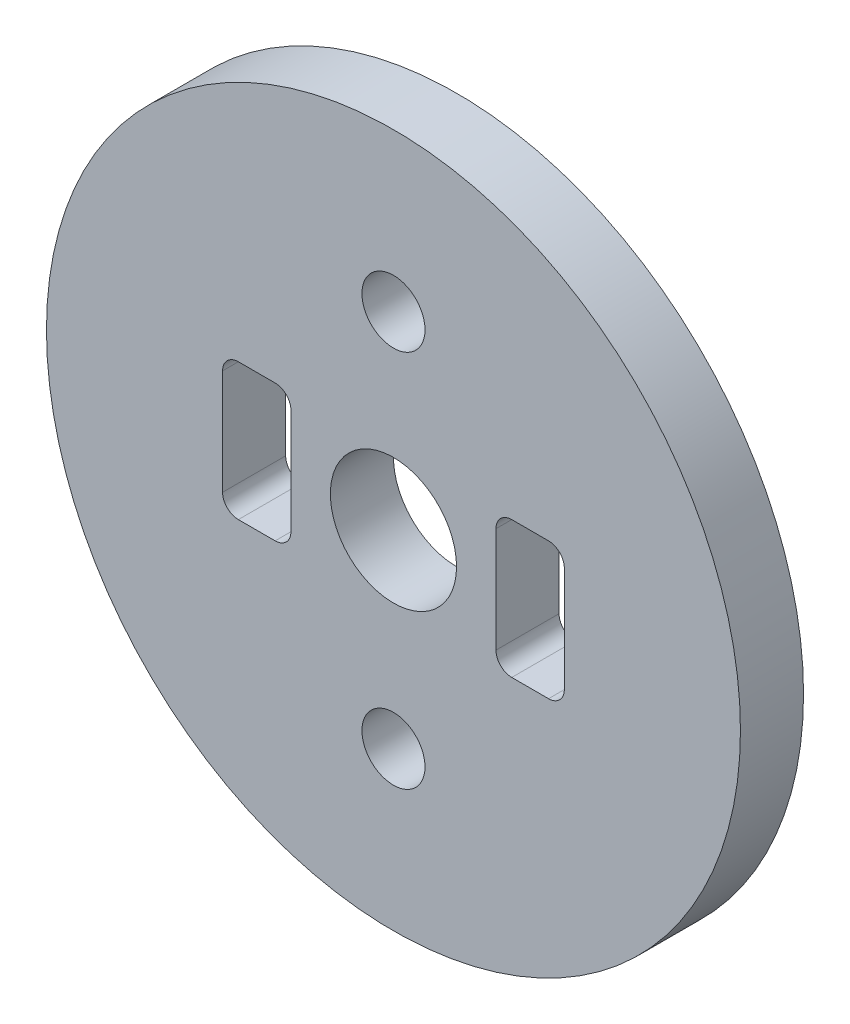
ISO-10303-21;
HEADER;
FILE_DESCRIPTION(('STEP AP214'),'2;1');
FILE_NAME('part.step','',(''),(''),'','','');
FILE_SCHEMA(('AUTOMOTIVE_DESIGN { 1 0 10303 214 1 1 1 1 }'));
ENDSEC;
DATA;
#1=APPLICATION_CONTEXT('core data for automotive mechanical design processes');
#2=APPLICATION_PROTOCOL_DEFINITION('international standard','automotive_design',2000,#1);
#3=PRODUCT_CONTEXT('',#1,'mechanical');
#4=PRODUCT('Part','Part','',(#3));
#5=PRODUCT_RELATED_PRODUCT_CATEGORY('part','',(#4));
#6=PRODUCT_DEFINITION_FORMATION('','',#4);
#7=PRODUCT_DEFINITION_CONTEXT('part definition',#1,'design');
#8=PRODUCT_DEFINITION('design','',#6,#7);
#9=PRODUCT_DEFINITION_SHAPE('','',#8);
#10=(LENGTH_UNIT() NAMED_UNIT(*) SI_UNIT(.MILLI.,.METRE.));
#11=(NAMED_UNIT(*) PLANE_ANGLE_UNIT() SI_UNIT($,.RADIAN.));
#12=(NAMED_UNIT(*) SI_UNIT($,.STERADIAN.) SOLID_ANGLE_UNIT());
#13=UNCERTAINTY_MEASURE_WITH_UNIT(LENGTH_MEASURE(1.E-05),#10,'distance_accuracy_value','');
#14=(GEOMETRIC_REPRESENTATION_CONTEXT(3) GLOBAL_UNCERTAINTY_ASSIGNED_CONTEXT((#13)) GLOBAL_UNIT_ASSIGNED_CONTEXT((#10,
#11,#12)) REPRESENTATION_CONTEXT('',''));
#15=CARTESIAN_POINT('',(0.,0.,0.));
#16=DIRECTION('',(0.,0.,1.));
#17=DIRECTION('',(1.,0.,0.));
#18=AXIS2_PLACEMENT_3D('',#15,#16,#17);
#19=CARTESIAN_POINT('',(215.7478079135,241.9520199932,3.));
#20=DIRECTION('',(0.,0.,1.));
#21=DIRECTION('',(1.,0.,0.));
#22=AXIS2_PLACEMENT_3D('',#19,#20,#21);
#23=PLANE('',#22);
#24=DIRECTION('',(0.,-1.,0.));
#25=VECTOR('',#24,1.);
#26=CARTESIAN_POINT('',(220.6228079135,244.4520199932,3.));
#27=LINE('',#26,#25);
#28=CARTESIAN_POINT('',(220.6228079135,244.4520199932,3.));
#29=VERTEX_POINT('',#28);
#30=CARTESIAN_POINT('',(220.6228079135,239.4520199932,3.));
#31=VERTEX_POINT('',#30);
#32=EDGE_CURVE('E213',#29,#31,#27,.T.);
#33=ORIENTED_EDGE('',*,*,#32,.F.);
#34=CARTESIAN_POINT('',(221.3728079135,244.4520199932,3.));
#35=DIRECTION('',(0.,0.,1.));
#36=DIRECTION('',(1.,0.,0.));
#37=AXIS2_PLACEMENT_3D('',#34,#35,#36);
#38=CIRCLE('',#37,0.750000000000001);
#39=CARTESIAN_POINT('',(221.3728079135,245.2020199932,3.));
#40=VERTEX_POINT('',#39);
#41=EDGE_CURVE('E211',#40,#29,#38,.T.);
#42=ORIENTED_EDGE('',*,*,#41,.F.);
#43=DIRECTION('',(-1.,0.,0.));
#44=VECTOR('',#43,1.);
#45=CARTESIAN_POINT('',(223.1228079135,245.2020199932,3.));
#46=LINE('',#45,#44);
#47=CARTESIAN_POINT('',(223.1228079135,245.2020199932,3.));
#48=VERTEX_POINT('',#47);
#49=EDGE_CURVE('E227',#48,#40,#46,.T.);
#50=ORIENTED_EDGE('',*,*,#49,.F.);
#51=CARTESIAN_POINT('',(223.1228079135,244.4520199932,3.));
#52=DIRECTION('',(0.,0.,1.));
#53=DIRECTION('',(1.,0.,0.));
#54=AXIS2_PLACEMENT_3D('',#51,#52,#53);
#55=CIRCLE('',#54,0.750000000000001);
#56=CARTESIAN_POINT('',(223.8728079135,244.4520199932,3.));
#57=VERTEX_POINT('',#56);
#58=EDGE_CURVE('E224',#57,#48,#55,.T.);
#59=ORIENTED_EDGE('',*,*,#58,.F.);
#60=DIRECTION('',(0.,1.,0.));
#61=VECTOR('',#60,1.);
#62=CARTESIAN_POINT('',(223.8728079135,239.4520199932,3.));
#63=LINE('',#62,#61);
#64=CARTESIAN_POINT('',(223.8728079135,239.4520199932,3.));
#65=VERTEX_POINT('',#64);
#66=EDGE_CURVE('E222',#65,#57,#63,.T.);
#67=ORIENTED_EDGE('',*,*,#66,.F.);
#68=CARTESIAN_POINT('',(223.1228079135,239.4520199932,3.));
#69=DIRECTION('',(0.,0.,1.));
#70=DIRECTION('',(1.,0.,0.));
#71=AXIS2_PLACEMENT_3D('',#68,#69,#70);
#72=CIRCLE('',#71,0.750000000000001);
#73=CARTESIAN_POINT('',(223.1228079135,238.7020199932,3.));
#74=VERTEX_POINT('',#73);
#75=EDGE_CURVE('E220',#74,#65,#72,.T.);
#76=ORIENTED_EDGE('',*,*,#75,.F.);
#77=DIRECTION('',(1.,0.,0.));
#78=VECTOR('',#77,1.);
#79=CARTESIAN_POINT('',(221.3728079135,238.7020199932,3.));
#80=LINE('',#79,#78);
#81=CARTESIAN_POINT('',(221.3728079135,238.7020199932,3.));
#82=VERTEX_POINT('',#81);
#83=EDGE_CURVE('E218',#82,#74,#80,.T.);
#84=ORIENTED_EDGE('',*,*,#83,.F.);
#85=CARTESIAN_POINT('',(221.3728079135,239.4520199932,3.));
#86=DIRECTION('',(0.,0.,1.));
#87=DIRECTION('',(1.,0.,0.));
#88=AXIS2_PLACEMENT_3D('',#85,#86,#87);
#89=CIRCLE('',#88,0.750000000000001);
#90=EDGE_CURVE('E216',#31,#82,#89,.T.);
#91=ORIENTED_EDGE('',*,*,#90,.F.);
#92=EDGE_LOOP('',(#33,#42,#50,#59,#67,#76,#84,#91));
#93=FACE_BOUND('',#92,.T.);
#94=CARTESIAN_POINT('',(215.7478079135,232.9520199932,3.));
#95=DIRECTION('',(0.,0.,1.));
#96=DIRECTION('',(1.,0.,0.));
#97=AXIS2_PLACEMENT_3D('',#94,#95,#96);
#98=CIRCLE('',#97,1.5);
#99=CARTESIAN_POINT('',(217.2478079135,232.9520199932,3.));
#100=VERTEX_POINT('',#99);
#101=EDGE_CURVE('E276',#100,#100,#98,.T.);
#102=ORIENTED_EDGE('',*,*,#101,.F.);
#103=EDGE_LOOP('',(#102));
#104=FACE_BOUND('',#103,.T.);
#105=CARTESIAN_POINT('',(215.7478079135,241.9520199932,3.));
#106=DIRECTION('',(0.,0.,1.));
#107=DIRECTION('',(1.,0.,0.));
#108=AXIS2_PLACEMENT_3D('',#105,#106,#107);
#109=CIRCLE('',#108,16.5);
#110=CARTESIAN_POINT('',(232.2478079135,241.9520199932,3.));
#111=VERTEX_POINT('',#110);
#112=EDGE_CURVE('E11',#111,#111,#109,.T.);
#113=ORIENTED_EDGE('',*,*,#112,.T.);
#114=EDGE_LOOP('',(#113));
#115=FACE_BOUND('',#114,.T.);
#116=CARTESIAN_POINT('',(215.7478079135,241.9520199932,3.));
#117=DIRECTION('',(0.,0.,1.));
#118=DIRECTION('',(1.,0.,0.));
#119=AXIS2_PLACEMENT_3D('',#116,#117,#118);
#120=CIRCLE('',#119,3.);
#121=CARTESIAN_POINT('',(218.7478079135,241.9520199932,3.));
#122=VERTEX_POINT('',#121);
#123=EDGE_CURVE('E282',#122,#122,#120,.T.);
#124=ORIENTED_EDGE('',*,*,#123,.F.);
#125=EDGE_LOOP('',(#124));
#126=FACE_BOUND('',#125,.T.);
#127=CARTESIAN_POINT('',(215.7478079135,250.9520199932,3.));
#128=DIRECTION('',(0.,0.,1.));
#129=DIRECTION('',(1.,0.,0.));
#130=AXIS2_PLACEMENT_3D('',#127,#128,#129);
#131=CIRCLE('',#130,1.5);
#132=CARTESIAN_POINT('',(217.2478079135,250.9520199932,3.));
#133=VERTEX_POINT('',#132);
#134=EDGE_CURVE('E270',#133,#133,#131,.T.);
#135=ORIENTED_EDGE('',*,*,#134,.F.);
#136=EDGE_LOOP('',(#135));
#137=FACE_BOUND('',#136,.T.);
#138=DIRECTION('',(-1.,0.,0.));
#139=VECTOR('',#138,1.);
#140=CARTESIAN_POINT('',(208.3728079135,245.2020199932,3.));
#141=LINE('',#140,#139);
#142=CARTESIAN_POINT('',(210.1228079135,245.2020199932,3.));
#143=VERTEX_POINT('',#142);
#144=CARTESIAN_POINT('',(208.3728079135,245.2020199932,3.));
#145=VERTEX_POINT('',#144);
#146=EDGE_CURVE('E154',#143,#145,#141,.T.);
#147=ORIENTED_EDGE('',*,*,#146,.F.);
#148=CARTESIAN_POINT('',(210.1228079135,244.4520199932,3.));
#149=DIRECTION('',(0.,0.,1.));
#150=DIRECTION('',(1.,0.,0.));
#151=AXIS2_PLACEMENT_3D('',#148,#149,#150);
#152=CIRCLE('',#151,0.750000000000001);
#153=CARTESIAN_POINT('',(210.8728079135,244.4520199932,3.));
#154=VERTEX_POINT('',#153);
#155=EDGE_CURVE('E146',#154,#143,#152,.T.);
#156=ORIENTED_EDGE('',*,*,#155,.F.);
#157=DIRECTION('',(0.,1.,0.));
#158=VECTOR('',#157,1.);
#159=CARTESIAN_POINT('',(210.8728079135,244.4520199932,3.));
#160=LINE('',#159,#158);
#161=CARTESIAN_POINT('',(210.8728079135,239.4520199932,3.));
#162=VERTEX_POINT('',#161);
#163=EDGE_CURVE('E179',#162,#154,#160,.T.);
#164=ORIENTED_EDGE('',*,*,#163,.F.);
#165=CARTESIAN_POINT('',(210.1228079135,239.4520199932,3.));
#166=DIRECTION('',(0.,0.,1.));
#167=DIRECTION('',(1.,0.,0.));
#168=AXIS2_PLACEMENT_3D('',#165,#166,#167);
#169=CIRCLE('',#168,0.750000000000001);
#170=CARTESIAN_POINT('',(210.1228079135,238.7020199932,3.));
#171=VERTEX_POINT('',#170);
#172=EDGE_CURVE('E177',#171,#162,#169,.T.);
#173=ORIENTED_EDGE('',*,*,#172,.F.);
#174=DIRECTION('',(1.,0.,0.));
#175=VECTOR('',#174,1.);
#176=CARTESIAN_POINT('',(210.1228079135,238.7020199932,3.));
#177=LINE('',#176,#175);
#178=CARTESIAN_POINT('',(208.3728079135,238.7020199932,3.));
#179=VERTEX_POINT('',#178);
#180=EDGE_CURVE('E175',#179,#171,#177,.T.);
#181=ORIENTED_EDGE('',*,*,#180,.F.);
#182=CARTESIAN_POINT('',(208.3728079135,239.4520199932,3.));
#183=DIRECTION('',(0.,0.,1.));
#184=DIRECTION('',(1.,0.,0.));
#185=AXIS2_PLACEMENT_3D('',#182,#183,#184);
#186=CIRCLE('',#185,0.750000000000237);
#187=CARTESIAN_POINT('',(207.6228079135,239.4520199932,3.));
#188=VERTEX_POINT('',#187);
#189=EDGE_CURVE('E173',#188,#179,#186,.T.);
#190=ORIENTED_EDGE('',*,*,#189,.F.);
#191=DIRECTION('',(0.,-1.,0.));
#192=VECTOR('',#191,1.);
#193=CARTESIAN_POINT('',(207.6228079135,239.4520199932,3.));
#194=LINE('',#193,#192);
#195=CARTESIAN_POINT('',(207.6228079135,244.4520199932,3.));
#196=VERTEX_POINT('',#195);
#197=EDGE_CURVE('E169',#196,#188,#194,.T.);
#198=ORIENTED_EDGE('',*,*,#197,.F.);
#199=CARTESIAN_POINT('',(208.3728079135,244.4520199932,3.));
#200=DIRECTION('',(0.,0.,1.));
#201=DIRECTION('',(1.,0.,0.));
#202=AXIS2_PLACEMENT_3D('',#199,#200,#201);
#203=CIRCLE('',#202,0.750000000000001);
#204=EDGE_CURVE('E167',#145,#196,#203,.T.);
#205=ORIENTED_EDGE('',*,*,#204,.F.);
#206=EDGE_LOOP('',(#147,#156,#164,#173,#181,#190,#198,#205));
#207=FACE_BOUND('',#206,.T.);
#208=ADVANCED_FACE('F33',(#93,#104,#115,#126,#137,#207),#23,.T.);
#209=CARTESIAN_POINT('',(215.7478079135,241.9520199932,0.));
#210=DIRECTION('',(0.,0.,1.));
#211=DIRECTION('',(1.,0.,0.));
#212=AXIS2_PLACEMENT_3D('',#209,#210,#211);
#213=PLANE('',#212);
#214=CARTESIAN_POINT('',(221.3728079135,244.4520199932,0.));
#215=DIRECTION('',(0.,0.,1.));
#216=DIRECTION('',(1.,0.,0.));
#217=AXIS2_PLACEMENT_3D('',#214,#215,#216);
#218=CIRCLE('',#217,0.750000000000001);
#219=CARTESIAN_POINT('',(221.3728079135,245.2020199932,0.));
#220=VERTEX_POINT('',#219);
#221=CARTESIAN_POINT('',(220.6228079135,244.4520199932,0.));
#222=VERTEX_POINT('',#221);
#223=EDGE_CURVE('E162',#220,#222,#218,.T.);
#224=ORIENTED_EDGE('',*,*,#223,.T.);
#225=DIRECTION('',(0.,-1.,0.));
#226=VECTOR('',#225,1.);
#227=CARTESIAN_POINT('',(220.6228079135,244.4520199932,0.));
#228=LINE('',#227,#226);
#229=CARTESIAN_POINT('',(220.6228079135,239.4520199932,0.));
#230=VERTEX_POINT('',#229);
#231=EDGE_CURVE('E232',#222,#230,#228,.T.);
#232=ORIENTED_EDGE('',*,*,#231,.T.);
#233=CARTESIAN_POINT('',(221.3728079135,239.4520199932,0.));
#234=DIRECTION('',(0.,0.,1.));
#235=DIRECTION('',(1.,0.,0.));
#236=AXIS2_PLACEMENT_3D('',#233,#234,#235);
#237=CIRCLE('',#236,0.750000000000001);
#238=CARTESIAN_POINT('',(221.3728079135,238.7020199932,0.));
#239=VERTEX_POINT('',#238);
#240=EDGE_CURVE('E235',#230,#239,#237,.T.);
#241=ORIENTED_EDGE('',*,*,#240,.T.);
#242=DIRECTION('',(1.,0.,0.));
#243=VECTOR('',#242,1.);
#244=CARTESIAN_POINT('',(221.3728079135,238.7020199932,0.));
#245=LINE('',#244,#243);
#246=CARTESIAN_POINT('',(223.1228079135,238.7020199932,0.));
#247=VERTEX_POINT('',#246);
#248=EDGE_CURVE('E238',#239,#247,#245,.T.);
#249=ORIENTED_EDGE('',*,*,#248,.T.);
#250=CARTESIAN_POINT('',(223.1228079135,239.4520199932,0.));
#251=DIRECTION('',(0.,0.,1.));
#252=DIRECTION('',(1.,0.,0.));
#253=AXIS2_PLACEMENT_3D('',#250,#251,#252);
#254=CIRCLE('',#253,0.750000000000001);
#255=CARTESIAN_POINT('',(223.8728079135,239.4520199932,0.));
#256=VERTEX_POINT('',#255);
#257=EDGE_CURVE('E241',#247,#256,#254,.T.);
#258=ORIENTED_EDGE('',*,*,#257,.T.);
#259=DIRECTION('',(0.,1.,0.));
#260=VECTOR('',#259,1.);
#261=CARTESIAN_POINT('',(223.8728079135,239.4520199932,0.));
#262=LINE('',#261,#260);
#263=CARTESIAN_POINT('',(223.8728079135,244.4520199932,0.));
#264=VERTEX_POINT('',#263);
#265=EDGE_CURVE('E244',#256,#264,#262,.T.);
#266=ORIENTED_EDGE('',*,*,#265,.T.);
#267=CARTESIAN_POINT('',(223.1228079135,244.4520199932,0.));
#268=DIRECTION('',(0.,0.,1.));
#269=DIRECTION('',(1.,0.,0.));
#270=AXIS2_PLACEMENT_3D('',#267,#268,#269);
#271=CIRCLE('',#270,0.750000000000001);
#272=CARTESIAN_POINT('',(223.1228079135,245.2020199932,0.));
#273=VERTEX_POINT('',#272);
#274=EDGE_CURVE('E247',#264,#273,#271,.T.);
#275=ORIENTED_EDGE('',*,*,#274,.T.);
#276=DIRECTION('',(-1.,0.,0.));
#277=VECTOR('',#276,1.);
#278=CARTESIAN_POINT('',(223.1228079135,245.2020199932,0.));
#279=LINE('',#278,#277);
#280=EDGE_CURVE('E214',#273,#220,#279,.T.);
#281=ORIENTED_EDGE('',*,*,#280,.T.);
#282=EDGE_LOOP('',(#224,#232,#241,#249,#258,#266,#275,#281));
#283=FACE_BOUND('',#282,.T.);
#284=CARTESIAN_POINT('',(215.7478079135,232.9520199932,0.));
#285=DIRECTION('',(0.,0.,1.));
#286=DIRECTION('',(1.,0.,0.));
#287=AXIS2_PLACEMENT_3D('',#284,#285,#286);
#288=CIRCLE('',#287,1.5);
#289=CARTESIAN_POINT('',(217.2478079135,232.9520199932,0.));
#290=VERTEX_POINT('',#289);
#291=EDGE_CURVE('E273',#290,#290,#288,.T.);
#292=ORIENTED_EDGE('',*,*,#291,.T.);
#293=EDGE_LOOP('',(#292));
#294=FACE_BOUND('',#293,.T.);
#295=CARTESIAN_POINT('',(215.7478079135,241.9520199932,0.));
#296=DIRECTION('',(0.,0.,1.));
#297=DIRECTION('',(1.,0.,0.));
#298=AXIS2_PLACEMENT_3D('',#295,#296,#297);
#299=CIRCLE('',#298,16.5);
#300=CARTESIAN_POINT('',(232.2478079135,241.9520199932,0.));
#301=VERTEX_POINT('',#300);
#302=EDGE_CURVE('E37',#301,#301,#299,.T.);
#303=ORIENTED_EDGE('',*,*,#302,.F.);
#304=EDGE_LOOP('',(#303));
#305=FACE_BOUND('',#304,.T.);
#306=CARTESIAN_POINT('',(215.7478079135,241.9520199932,0.));
#307=DIRECTION('',(0.,0.,1.));
#308=DIRECTION('',(1.,0.,0.));
#309=AXIS2_PLACEMENT_3D('',#306,#307,#308);
#310=CIRCLE('',#309,3.);
#311=CARTESIAN_POINT('',(218.7478079135,241.9520199932,0.));
#312=VERTEX_POINT('',#311);
#313=EDGE_CURVE('E279',#312,#312,#310,.T.);
#314=ORIENTED_EDGE('',*,*,#313,.T.);
#315=EDGE_LOOP('',(#314));
#316=FACE_BOUND('',#315,.T.);
#317=CARTESIAN_POINT('',(215.7478079135,250.9520199932,0.));
#318=DIRECTION('',(0.,0.,1.));
#319=DIRECTION('',(1.,0.,0.));
#320=AXIS2_PLACEMENT_3D('',#317,#318,#319);
#321=CIRCLE('',#320,1.5);
#322=CARTESIAN_POINT('',(217.2478079135,250.9520199932,0.));
#323=VERTEX_POINT('',#322);
#324=EDGE_CURVE('E269',#323,#323,#321,.T.);
#325=ORIENTED_EDGE('',*,*,#324,.T.);
#326=EDGE_LOOP('',(#325));
#327=FACE_BOUND('',#326,.T.);
#328=CARTESIAN_POINT('',(210.1228079135,244.4520199932,0.));
#329=DIRECTION('',(0.,0.,1.));
#330=DIRECTION('',(1.,0.,0.));
#331=AXIS2_PLACEMENT_3D('',#328,#329,#330);
#332=CIRCLE('',#331,0.750000000000001);
#333=CARTESIAN_POINT('',(210.8728079135,244.4520199932,0.));
#334=VERTEX_POINT('',#333);
#335=CARTESIAN_POINT('',(210.1228079135,245.2020199932,0.));
#336=VERTEX_POINT('',#335);
#337=EDGE_CURVE('E56',#334,#336,#332,.T.);
#338=ORIENTED_EDGE('',*,*,#337,.T.);
#339=DIRECTION('',(-1.,0.,0.));
#340=VECTOR('',#339,1.);
#341=CARTESIAN_POINT('',(208.3728079135,245.2020199932,0.));
#342=LINE('',#341,#340);
#343=CARTESIAN_POINT('',(208.3728079135,245.2020199932,0.));
#344=VERTEX_POINT('',#343);
#345=EDGE_CURVE('E161',#336,#344,#342,.T.);
#346=ORIENTED_EDGE('',*,*,#345,.T.);
#347=CARTESIAN_POINT('',(208.3728079135,244.4520199932,0.));
#348=DIRECTION('',(0.,0.,1.));
#349=DIRECTION('',(1.,0.,0.));
#350=AXIS2_PLACEMENT_3D('',#347,#348,#349);
#351=CIRCLE('',#350,0.750000000000001);
#352=CARTESIAN_POINT('',(207.6228079135,244.4520199932,0.));
#353=VERTEX_POINT('',#352);
#354=EDGE_CURVE('E183',#344,#353,#351,.T.);
#355=ORIENTED_EDGE('',*,*,#354,.T.);
#356=DIRECTION('',(0.,-1.,0.));
#357=VECTOR('',#356,1.);
#358=CARTESIAN_POINT('',(207.6228079135,239.4520199932,0.));
#359=LINE('',#358,#357);
#360=CARTESIAN_POINT('',(207.6228079135,239.4520199932,0.));
#361=VERTEX_POINT('',#360);
#362=EDGE_CURVE('E186',#353,#361,#359,.T.);
#363=ORIENTED_EDGE('',*,*,#362,.T.);
#364=CARTESIAN_POINT('',(208.3728079135,239.4520199932,0.));
#365=DIRECTION('',(0.,0.,1.));
#366=DIRECTION('',(1.,0.,0.));
#367=AXIS2_PLACEMENT_3D('',#364,#365,#366);
#368=CIRCLE('',#367,0.750000000000237);
#369=CARTESIAN_POINT('',(208.3728079135,238.7020199932,0.));
#370=VERTEX_POINT('',#369);
#371=EDGE_CURVE('E189',#361,#370,#368,.T.);
#372=ORIENTED_EDGE('',*,*,#371,.T.);
#373=DIRECTION('',(1.,0.,0.));
#374=VECTOR('',#373,1.);
#375=CARTESIAN_POINT('',(210.1228079135,238.7020199932,0.));
#376=LINE('',#375,#374);
#377=CARTESIAN_POINT('',(210.1228079135,238.7020199932,0.));
#378=VERTEX_POINT('',#377);
#379=EDGE_CURVE('E192',#370,#378,#376,.T.);
#380=ORIENTED_EDGE('',*,*,#379,.T.);
#381=CARTESIAN_POINT('',(210.1228079135,239.4520199932,0.));
#382=DIRECTION('',(0.,0.,1.));
#383=DIRECTION('',(1.,0.,0.));
#384=AXIS2_PLACEMENT_3D('',#381,#382,#383);
#385=CIRCLE('',#384,0.750000000000001);
#386=CARTESIAN_POINT('',(210.8728079135,239.4520199932,0.));
#387=VERTEX_POINT('',#386);
#388=EDGE_CURVE('E195',#378,#387,#385,.T.);
#389=ORIENTED_EDGE('',*,*,#388,.T.);
#390=DIRECTION('',(0.,1.,0.));
#391=VECTOR('',#390,1.);
#392=CARTESIAN_POINT('',(210.8728079135,244.4520199932,0.));
#393=LINE('',#392,#391);
#394=EDGE_CURVE('E155',#387,#334,#393,.T.);
#395=ORIENTED_EDGE('',*,*,#394,.T.);
#396=EDGE_LOOP('',(#338,#346,#355,#363,#372,#380,#389,#395));
#397=FACE_BOUND('',#396,.T.);
#398=ADVANCED_FACE('F288',(#283,#294,#305,#316,#327,#397),#213,.F.);
#399=CARTESIAN_POINT('',(215.7478079135,241.9520199932,3.));
#400=DIRECTION('',(0.,0.,-1.));
#401=DIRECTION('',(-1.,0.,0.));
#402=AXIS2_PLACEMENT_3D('',#399,#400,#401);
#403=CYLINDRICAL_SURFACE('',#402,16.5);
#404=ORIENTED_EDGE('',*,*,#112,.F.);
#405=EDGE_LOOP('',(#404));
#406=FACE_BOUND('',#405,.T.);
#407=ORIENTED_EDGE('',*,*,#302,.T.);
#408=EDGE_LOOP('',(#407));
#409=FACE_BOUND('',#408,.T.);
#410=ADVANCED_FACE('F35',(#406,#409),#403,.T.);
#411=CARTESIAN_POINT('',(215.7478079135,241.9520199932,3.));
#412=DIRECTION('',(0.,0.,-1.));
#413=DIRECTION('',(-1.,0.,0.));
#414=AXIS2_PLACEMENT_3D('',#411,#412,#413);
#415=CYLINDRICAL_SURFACE('',#414,3.);
#416=ORIENTED_EDGE('',*,*,#123,.T.);
#417=EDGE_LOOP('',(#416));
#418=FACE_BOUND('',#417,.T.);
#419=ORIENTED_EDGE('',*,*,#313,.F.);
#420=EDGE_LOOP('',(#419));
#421=FACE_BOUND('',#420,.T.);
#422=ADVANCED_FACE('F291',(#418,#421),#415,.F.);
#423=CARTESIAN_POINT('',(215.7478079135,232.9520199932,3.));
#424=DIRECTION('',(0.,0.,-1.));
#425=DIRECTION('',(-1.,0.,0.));
#426=AXIS2_PLACEMENT_3D('',#423,#424,#425);
#427=CYLINDRICAL_SURFACE('',#426,1.5);
#428=ORIENTED_EDGE('',*,*,#101,.T.);
#429=EDGE_LOOP('',(#428));
#430=FACE_BOUND('',#429,.T.);
#431=ORIENTED_EDGE('',*,*,#291,.F.);
#432=EDGE_LOOP('',(#431));
#433=FACE_BOUND('',#432,.T.);
#434=ADVANCED_FACE('F293',(#430,#433),#427,.F.);
#435=CARTESIAN_POINT('',(215.7478079135,250.9520199932,3.));
#436=DIRECTION('',(0.,0.,-1.));
#437=DIRECTION('',(-1.,0.,0.));
#438=AXIS2_PLACEMENT_3D('',#435,#436,#437);
#439=CYLINDRICAL_SURFACE('',#438,1.5);
#440=ORIENTED_EDGE('',*,*,#134,.T.);
#441=EDGE_LOOP('',(#440));
#442=FACE_BOUND('',#441,.T.);
#443=ORIENTED_EDGE('',*,*,#324,.F.);
#444=EDGE_LOOP('',(#443));
#445=FACE_BOUND('',#444,.T.);
#446=ADVANCED_FACE('F300',(#442,#445),#439,.F.);
#447=CARTESIAN_POINT('',(221.3728079135,244.4520199932,3.));
#448=DIRECTION('',(0.,0.,-1.));
#449=DIRECTION('',(-1.,0.,0.));
#450=AXIS2_PLACEMENT_3D('',#447,#448,#449);
#451=CYLINDRICAL_SURFACE('',#450,0.750000000000001);
#452=ORIENTED_EDGE('',*,*,#223,.F.);
#453=DIRECTION('',(0.,0.,-1.));
#454=VECTOR('',#453,1.);
#455=CARTESIAN_POINT('',(221.3728079135,245.2020199932,3.));
#456=LINE('',#455,#454);
#457=EDGE_CURVE('E229',#40,#220,#456,.T.);
#458=ORIENTED_EDGE('',*,*,#457,.F.);
#459=ORIENTED_EDGE('',*,*,#41,.T.);
#460=DIRECTION('',(0.,0.,-1.));
#461=VECTOR('',#460,1.);
#462=CARTESIAN_POINT('',(220.6228079135,244.4520199932,3.));
#463=LINE('',#462,#461);
#464=EDGE_CURVE('E266',#29,#222,#463,.T.);
#465=ORIENTED_EDGE('',*,*,#464,.T.);
#466=EDGE_LOOP('',(#452,#458,#459,#465));
#467=FACE_BOUND('',#466,.T.);
#468=ADVANCED_FACE('F325',(#467),#451,.F.);
#469=CARTESIAN_POINT('',(220.6228079135,244.4520199932,3.));
#470=DIRECTION('',(1.,0.,0.));
#471=DIRECTION('',(0.,0.,-1.));
#472=AXIS2_PLACEMENT_3D('',#469,#470,#471);
#473=PLANE('',#472);
#474=ORIENTED_EDGE('',*,*,#231,.F.);
#475=ORIENTED_EDGE('',*,*,#464,.F.);
#476=ORIENTED_EDGE('',*,*,#32,.T.);
#477=DIRECTION('',(0.,0.,-1.));
#478=VECTOR('',#477,1.);
#479=CARTESIAN_POINT('',(220.6228079135,239.4520199932,3.));
#480=LINE('',#479,#478);
#481=EDGE_CURVE('E264',#31,#230,#480,.T.);
#482=ORIENTED_EDGE('',*,*,#481,.T.);
#483=EDGE_LOOP('',(#474,#475,#476,#482));
#484=FACE_BOUND('',#483,.T.);
#485=ADVANCED_FACE('F387',(#484),#473,.T.);
#486=CARTESIAN_POINT('',(221.3728079135,239.4520199932,3.));
#487=DIRECTION('',(0.,0.,-1.));
#488=DIRECTION('',(-1.,0.,0.));
#489=AXIS2_PLACEMENT_3D('',#486,#487,#488);
#490=CYLINDRICAL_SURFACE('',#489,0.750000000000001);
#491=ORIENTED_EDGE('',*,*,#240,.F.);
#492=ORIENTED_EDGE('',*,*,#481,.F.);
#493=ORIENTED_EDGE('',*,*,#90,.T.);
#494=DIRECTION('',(0.,0.,-1.));
#495=VECTOR('',#494,1.);
#496=CARTESIAN_POINT('',(221.3728079135,238.7020199932,3.));
#497=LINE('',#496,#495);
#498=EDGE_CURVE('E262',#82,#239,#497,.T.);
#499=ORIENTED_EDGE('',*,*,#498,.T.);
#500=EDGE_LOOP('',(#491,#492,#493,#499));
#501=FACE_BOUND('',#500,.T.);
#502=ADVANCED_FACE('F383',(#501),#490,.F.);
#503=CARTESIAN_POINT('',(221.3728079135,238.7020199932,3.));
#504=DIRECTION('',(0.,1.,0.));
#505=DIRECTION('',(0.,0.,1.));
#506=AXIS2_PLACEMENT_3D('',#503,#504,#505);
#507=PLANE('',#506);
#508=ORIENTED_EDGE('',*,*,#248,.F.);
#509=ORIENTED_EDGE('',*,*,#498,.F.);
#510=ORIENTED_EDGE('',*,*,#83,.T.);
#511=DIRECTION('',(0.,0.,-1.));
#512=VECTOR('',#511,1.);
#513=CARTESIAN_POINT('',(223.1228079135,238.7020199932,3.));
#514=LINE('',#513,#512);
#515=EDGE_CURVE('E260',#74,#247,#514,.T.);
#516=ORIENTED_EDGE('',*,*,#515,.T.);
#517=EDGE_LOOP('',(#508,#509,#510,#516));
#518=FACE_BOUND('',#517,.T.);
#519=ADVANCED_FACE('F379',(#518),#507,.T.);
#520=CARTESIAN_POINT('',(223.1228079135,239.4520199932,3.));
#521=DIRECTION('',(0.,0.,-1.));
#522=DIRECTION('',(-1.,0.,0.));
#523=AXIS2_PLACEMENT_3D('',#520,#521,#522);
#524=CYLINDRICAL_SURFACE('',#523,0.750000000000001);
#525=ORIENTED_EDGE('',*,*,#257,.F.);
#526=ORIENTED_EDGE('',*,*,#515,.F.);
#527=ORIENTED_EDGE('',*,*,#75,.T.);
#528=DIRECTION('',(0.,0.,-1.));
#529=VECTOR('',#528,1.);
#530=CARTESIAN_POINT('',(223.8728079135,239.4520199932,3.));
#531=LINE('',#530,#529);
#532=EDGE_CURVE('E258',#65,#256,#531,.T.);
#533=ORIENTED_EDGE('',*,*,#532,.T.);
#534=EDGE_LOOP('',(#525,#526,#527,#533));
#535=FACE_BOUND('',#534,.T.);
#536=ADVANCED_FACE('F375',(#535),#524,.F.);
#537=CARTESIAN_POINT('',(223.8728079135,239.4520199932,3.));
#538=DIRECTION('',(-1.,0.,0.));
#539=DIRECTION('',(0.,0.,1.));
#540=AXIS2_PLACEMENT_3D('',#537,#538,#539);
#541=PLANE('',#540);
#542=ORIENTED_EDGE('',*,*,#265,.F.);
#543=ORIENTED_EDGE('',*,*,#532,.F.);
#544=ORIENTED_EDGE('',*,*,#66,.T.);
#545=DIRECTION('',(0.,0.,-1.));
#546=VECTOR('',#545,1.);
#547=CARTESIAN_POINT('',(223.8728079135,244.4520199932,3.));
#548=LINE('',#547,#546);
#549=EDGE_CURVE('E256',#57,#264,#548,.T.);
#550=ORIENTED_EDGE('',*,*,#549,.T.);
#551=EDGE_LOOP('',(#542,#543,#544,#550));
#552=FACE_BOUND('',#551,.T.);
#553=ADVANCED_FACE('F371',(#552),#541,.T.);
#554=CARTESIAN_POINT('',(223.1228079135,244.4520199932,3.));
#555=DIRECTION('',(0.,0.,-1.));
#556=DIRECTION('',(-1.,0.,0.));
#557=AXIS2_PLACEMENT_3D('',#554,#555,#556);
#558=CYLINDRICAL_SURFACE('',#557,0.750000000000001);
#559=ORIENTED_EDGE('',*,*,#274,.F.);
#560=ORIENTED_EDGE('',*,*,#549,.F.);
#561=ORIENTED_EDGE('',*,*,#58,.T.);
#562=DIRECTION('',(0.,0.,-1.));
#563=VECTOR('',#562,1.);
#564=CARTESIAN_POINT('',(223.1228079135,245.2020199932,3.));
#565=LINE('',#564,#563);
#566=EDGE_CURVE('E254',#48,#273,#565,.T.);
#567=ORIENTED_EDGE('',*,*,#566,.T.);
#568=EDGE_LOOP('',(#559,#560,#561,#567));
#569=FACE_BOUND('',#568,.T.);
#570=ADVANCED_FACE('F367',(#569),#558,.F.);
#571=CARTESIAN_POINT('',(223.1228079135,245.2020199932,3.));
#572=DIRECTION('',(0.,-1.,0.));
#573=DIRECTION('',(0.,0.,-1.));
#574=AXIS2_PLACEMENT_3D('',#571,#572,#573);
#575=PLANE('',#574);
#576=ORIENTED_EDGE('',*,*,#280,.F.);
#577=ORIENTED_EDGE('',*,*,#566,.F.);
#578=ORIENTED_EDGE('',*,*,#49,.T.);
#579=ORIENTED_EDGE('',*,*,#457,.T.);
#580=EDGE_LOOP('',(#576,#577,#578,#579));
#581=FACE_BOUND('',#580,.T.);
#582=ADVANCED_FACE('F364',(#581),#575,.T.);
#583=CARTESIAN_POINT('',(210.1228079135,244.4520199932,3.));
#584=DIRECTION('',(0.,0.,-1.));
#585=DIRECTION('',(-1.,0.,0.));
#586=AXIS2_PLACEMENT_3D('',#583,#584,#585);
#587=CYLINDRICAL_SURFACE('',#586,0.750000000000001);
#588=ORIENTED_EDGE('',*,*,#337,.F.);
#589=DIRECTION('',(0.,0.,-1.));
#590=VECTOR('',#589,1.);
#591=CARTESIAN_POINT('',(210.8728079135,244.4520199932,3.));
#592=LINE('',#591,#590);
#593=EDGE_CURVE('E150',#154,#334,#592,.T.);
#594=ORIENTED_EDGE('',*,*,#593,.F.);
#595=ORIENTED_EDGE('',*,*,#155,.T.);
#596=DIRECTION('',(0.,0.,-1.));
#597=VECTOR('',#596,1.);
#598=CARTESIAN_POINT('',(210.1228079135,245.2020199932,3.));
#599=LINE('',#598,#597);
#600=EDGE_CURVE('E149',#143,#336,#599,.T.);
#601=ORIENTED_EDGE('',*,*,#600,.T.);
#602=EDGE_LOOP('',(#588,#594,#595,#601));
#603=FACE_BOUND('',#602,.T.);
#604=ADVANCED_FACE('F148',(#603),#587,.F.);
#605=CARTESIAN_POINT('',(208.3728079135,245.2020199932,3.));
#606=DIRECTION('',(0.,-1.,0.));
#607=DIRECTION('',(0.,0.,-1.));
#608=AXIS2_PLACEMENT_3D('',#605,#606,#607);
#609=PLANE('',#608);
#610=ORIENTED_EDGE('',*,*,#345,.F.);
#611=ORIENTED_EDGE('',*,*,#600,.F.);
#612=ORIENTED_EDGE('',*,*,#146,.T.);
#613=DIRECTION('',(0.,0.,-1.));
#614=VECTOR('',#613,1.);
#615=CARTESIAN_POINT('',(208.3728079135,245.2020199932,3.));
#616=LINE('',#615,#614);
#617=EDGE_CURVE('E163',#145,#344,#616,.T.);
#618=ORIENTED_EDGE('',*,*,#617,.T.);
#619=EDGE_LOOP('',(#610,#611,#612,#618));
#620=FACE_BOUND('',#619,.T.);
#621=ADVANCED_FACE('F158',(#620),#609,.T.);
#622=CARTESIAN_POINT('',(208.3728079135,244.4520199932,3.));
#623=DIRECTION('',(0.,0.,-1.));
#624=DIRECTION('',(-1.,0.,0.));
#625=AXIS2_PLACEMENT_3D('',#622,#623,#624);
#626=CYLINDRICAL_SURFACE('',#625,0.750000000000001);
#627=ORIENTED_EDGE('',*,*,#354,.F.);
#628=ORIENTED_EDGE('',*,*,#617,.F.);
#629=ORIENTED_EDGE('',*,*,#204,.T.);
#630=DIRECTION('',(0.,0.,-1.));
#631=VECTOR('',#630,1.);
#632=CARTESIAN_POINT('',(207.6228079135,244.4520199932,3.));
#633=LINE('',#632,#631);
#634=EDGE_CURVE('E208',#196,#353,#633,.T.);
#635=ORIENTED_EDGE('',*,*,#634,.T.);
#636=EDGE_LOOP('',(#627,#628,#629,#635));
#637=FACE_BOUND('',#636,.T.);
#638=ADVANCED_FACE('F351',(#637),#626,.F.);
#639=CARTESIAN_POINT('',(207.6228079135,239.4520199932,3.));
#640=DIRECTION('',(1.,0.,0.));
#641=DIRECTION('',(0.,0.,-1.));
#642=AXIS2_PLACEMENT_3D('',#639,#640,#641);
#643=PLANE('',#642);
#644=ORIENTED_EDGE('',*,*,#362,.F.);
#645=ORIENTED_EDGE('',*,*,#634,.F.);
#646=ORIENTED_EDGE('',*,*,#197,.T.);
#647=DIRECTION('',(0.,0.,-1.));
#648=VECTOR('',#647,1.);
#649=CARTESIAN_POINT('',(207.6228079135,239.4520199932,3.));
#650=LINE('',#649,#648);
#651=EDGE_CURVE('E206',#188,#361,#650,.T.);
#652=ORIENTED_EDGE('',*,*,#651,.T.);
#653=EDGE_LOOP('',(#644,#645,#646,#652));
#654=FACE_BOUND('',#653,.T.);
#655=ADVANCED_FACE('F348',(#654),#643,.T.);
#656=CARTESIAN_POINT('',(208.3728079135,239.4520199932,3.));
#657=DIRECTION('',(0.,0.,-1.));
#658=DIRECTION('',(-1.,0.,0.));
#659=AXIS2_PLACEMENT_3D('',#656,#657,#658);
#660=CYLINDRICAL_SURFACE('',#659,0.750000000000237);
#661=ORIENTED_EDGE('',*,*,#371,.F.);
#662=ORIENTED_EDGE('',*,*,#651,.F.);
#663=ORIENTED_EDGE('',*,*,#189,.T.);
#664=DIRECTION('',(0.,0.,-1.));
#665=VECTOR('',#664,1.);
#666=CARTESIAN_POINT('',(208.3728079135,238.7020199932,3.));
#667=LINE('',#666,#665);
#668=EDGE_CURVE('E204',#179,#370,#667,.T.);
#669=ORIENTED_EDGE('',*,*,#668,.T.);
#670=EDGE_LOOP('',(#661,#662,#663,#669));
#671=FACE_BOUND('',#670,.T.);
#672=ADVANCED_FACE('F343',(#671),#660,.F.);
#673=CARTESIAN_POINT('',(210.1228079135,238.7020199932,3.));
#674=DIRECTION('',(0.,1.,0.));
#675=DIRECTION('',(0.,0.,1.));
#676=AXIS2_PLACEMENT_3D('',#673,#674,#675);
#677=PLANE('',#676);
#678=ORIENTED_EDGE('',*,*,#379,.F.);
#679=ORIENTED_EDGE('',*,*,#668,.F.);
#680=ORIENTED_EDGE('',*,*,#180,.T.);
#681=DIRECTION('',(0.,0.,-1.));
#682=VECTOR('',#681,1.);
#683=CARTESIAN_POINT('',(210.1228079135,238.7020199932,3.));
#684=LINE('',#683,#682);
#685=EDGE_CURVE('E202',#171,#378,#684,.T.);
#686=ORIENTED_EDGE('',*,*,#685,.T.);
#687=EDGE_LOOP('',(#678,#679,#680,#686));
#688=FACE_BOUND('',#687,.T.);
#689=ADVANCED_FACE('F339',(#688),#677,.T.);
#690=CARTESIAN_POINT('',(210.1228079135,239.4520199932,3.));
#691=DIRECTION('',(0.,0.,-1.));
#692=DIRECTION('',(-1.,0.,0.));
#693=AXIS2_PLACEMENT_3D('',#690,#691,#692);
#694=CYLINDRICAL_SURFACE('',#693,0.750000000000001);
#695=ORIENTED_EDGE('',*,*,#388,.F.);
#696=ORIENTED_EDGE('',*,*,#685,.F.);
#697=ORIENTED_EDGE('',*,*,#172,.T.);
#698=DIRECTION('',(0.,0.,-1.));
#699=VECTOR('',#698,1.);
#700=CARTESIAN_POINT('',(210.8728079135,239.4520199932,3.));
#701=LINE('',#700,#699);
#702=EDGE_CURVE('E48',#162,#387,#701,.T.);
#703=ORIENTED_EDGE('',*,*,#702,.T.);
#704=EDGE_LOOP('',(#695,#696,#697,#703));
#705=FACE_BOUND('',#704,.T.);
#706=ADVANCED_FACE('F336',(#705),#694,.F.);
#707=CARTESIAN_POINT('',(210.8728079135,244.4520199932,3.));
#708=DIRECTION('',(-1.,0.,0.));
#709=DIRECTION('',(0.,0.,1.));
#710=AXIS2_PLACEMENT_3D('',#707,#708,#709);
#711=PLANE('',#710);
#712=ORIENTED_EDGE('',*,*,#394,.F.);
#713=ORIENTED_EDGE('',*,*,#702,.F.);
#714=ORIENTED_EDGE('',*,*,#163,.T.);
#715=ORIENTED_EDGE('',*,*,#593,.T.);
#716=EDGE_LOOP('',(#712,#713,#714,#715));
#717=FACE_BOUND('',#716,.T.);
#718=ADVANCED_FACE('F330',(#717),#711,.T.);
#719=CLOSED_SHELL('',(#208,#398,#410,#422,#434,#446,#468,#485,#502,#519,#536,#553,#570,#582,
#604,#621,#638,#655,#672,#689,#706,#718));
#720=MANIFOLD_SOLID_BREP('B2',#719);
#721=ADVANCED_BREP_SHAPE_REPRESENTATION('',(#18,#720),#14);
#722=SHAPE_DEFINITION_REPRESENTATION(#9,#721);
ENDSEC;
END-ISO-10303-21;
